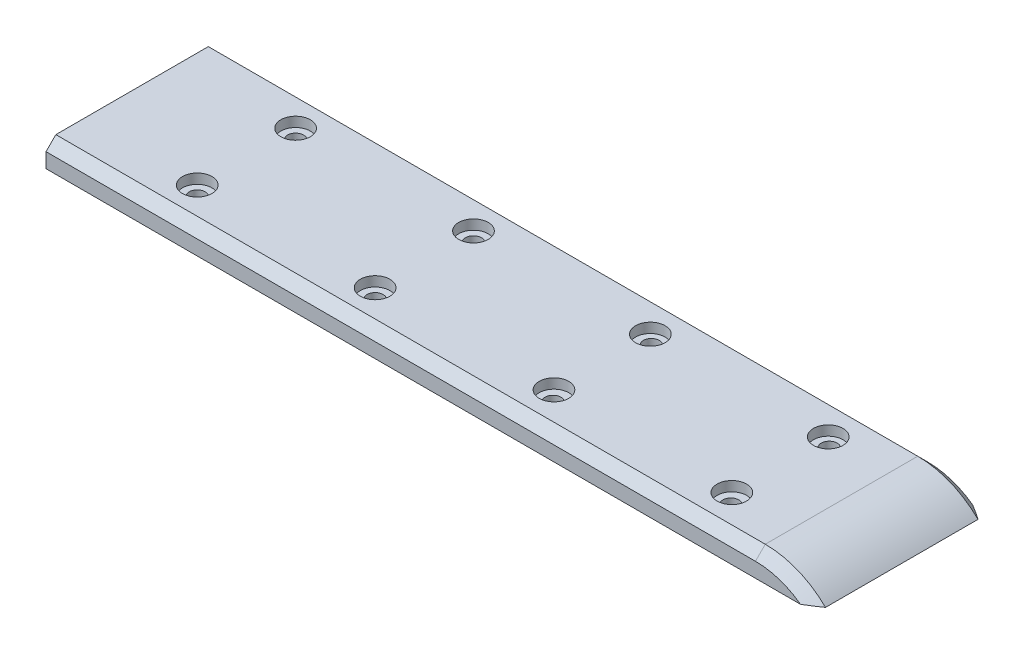
ISO-10303-21;
HEADER;
FILE_DESCRIPTION(('STEP AP214'),'2;1');
FILE_NAME('part.step','',(''),(''),'','','');
FILE_SCHEMA(('AUTOMOTIVE_DESIGN { 1 0 10303 214 1 1 1 1 }'));
ENDSEC;
DATA;
#1=APPLICATION_CONTEXT('core data for automotive mechanical design processes');
#2=APPLICATION_PROTOCOL_DEFINITION('international standard','automotive_design',2000,#1);
#3=PRODUCT_CONTEXT('',#1,'mechanical');
#4=PRODUCT('Part','Part','',(#3));
#5=PRODUCT_RELATED_PRODUCT_CATEGORY('part','',(#4));
#6=PRODUCT_DEFINITION_FORMATION('','',#4);
#7=PRODUCT_DEFINITION_CONTEXT('part definition',#1,'design');
#8=PRODUCT_DEFINITION('design','',#6,#7);
#9=PRODUCT_DEFINITION_SHAPE('','',#8);
#10=(LENGTH_UNIT() NAMED_UNIT(*) SI_UNIT(.MILLI.,.METRE.));
#11=(NAMED_UNIT(*) PLANE_ANGLE_UNIT() SI_UNIT($,.RADIAN.));
#12=(NAMED_UNIT(*) SI_UNIT($,.STERADIAN.) SOLID_ANGLE_UNIT());
#13=UNCERTAINTY_MEASURE_WITH_UNIT(LENGTH_MEASURE(1.E-05),#10,'distance_accuracy_value','');
#14=(GEOMETRIC_REPRESENTATION_CONTEXT(3) GLOBAL_UNCERTAINTY_ASSIGNED_CONTEXT((#13)) GLOBAL_UNIT_ASSIGNED_CONTEXT((#10,
#11,#12)) REPRESENTATION_CONTEXT('',''));
#15=CARTESIAN_POINT('',(0.,0.,0.));
#16=DIRECTION('',(0.,0.,1.));
#17=DIRECTION('',(1.,0.,0.));
#18=AXIS2_PLACEMENT_3D('',#15,#16,#17);
#19=CARTESIAN_POINT('',(62.5000000000001,22.0961940777126,10.));
#20=DIRECTION('',(0.,-1.,0.));
#21=DIRECTION('',(1.,0.,0.));
#22=AXIS2_PLACEMENT_3D('',#19,#20,#21);
#23=CYLINDRICAL_SURFACE('',#22,1.625);
#24=CARTESIAN_POINT('',(62.5000000000001,12.5,10.));
#25=DIRECTION('',(0.,1.,0.));
#26=DIRECTION('',(1.,0.,0.));
#27=AXIS2_PLACEMENT_3D('',#24,#25,#26);
#28=CIRCLE('',#27,1.625);
#29=CARTESIAN_POINT('',(64.1250000000001,12.5,10.));
#30=VERTEX_POINT('',#29);
#31=EDGE_CURVE('E155',#30,#30,#28,.T.);
#32=ORIENTED_EDGE('',*,*,#31,.F.);
#33=EDGE_LOOP('',(#32));
#34=FACE_BOUND('',#33,.T.);
#35=CARTESIAN_POINT('',(62.5000000000001,15.5,10.));
#36=DIRECTION('',(0.,1.,0.));
#37=DIRECTION('',(-1.,0.,0.));
#38=AXIS2_PLACEMENT_3D('',#35,#36,#37);
#39=CIRCLE('',#38,1.625);
#40=CARTESIAN_POINT('',(60.8750000000001,15.5,10.));
#41=VERTEX_POINT('',#40);
#42=EDGE_CURVE('E152',#41,#41,#39,.T.);
#43=ORIENTED_EDGE('',*,*,#42,.T.);
#44=EDGE_LOOP('',(#43));
#45=FACE_BOUND('',#44,.T.);
#46=ADVANCED_FACE('F37',(#34,#45),#23,.F.);
#47=CARTESIAN_POINT('',(26.3333333333334,22.0961940777126,9.99999999999997));
#48=DIRECTION('',(0.,-1.,0.));
#49=DIRECTION('',(1.,0.,0.));
#50=AXIS2_PLACEMENT_3D('',#47,#48,#49);
#51=CYLINDRICAL_SURFACE('',#50,1.625);
#52=CARTESIAN_POINT('',(26.3333333333334,12.5,9.99999999999997));
#53=DIRECTION('',(0.,1.,0.));
#54=DIRECTION('',(1.,0.,0.));
#55=AXIS2_PLACEMENT_3D('',#52,#53,#54);
#56=CIRCLE('',#55,1.625);
#57=CARTESIAN_POINT('',(27.9583333333334,12.5,9.99999999999997));
#58=VERTEX_POINT('',#57);
#59=EDGE_CURVE('E374',#58,#58,#56,.T.);
#60=ORIENTED_EDGE('',*,*,#59,.F.);
#61=EDGE_LOOP('',(#60));
#62=FACE_BOUND('',#61,.T.);
#63=CARTESIAN_POINT('',(26.3333333333334,15.5,9.99999999999997));
#64=DIRECTION('',(0.,1.,0.));
#65=DIRECTION('',(-1.,0.,0.));
#66=AXIS2_PLACEMENT_3D('',#63,#64,#65);
#67=CIRCLE('',#66,1.625);
#68=CARTESIAN_POINT('',(24.7083333333334,15.5,9.99999999999997));
#69=VERTEX_POINT('',#68);
#70=EDGE_CURVE('E149',#69,#69,#67,.T.);
#71=ORIENTED_EDGE('',*,*,#70,.T.);
#72=EDGE_LOOP('',(#71));
#73=FACE_BOUND('',#72,.T.);
#74=ADVANCED_FACE('F213',(#62,#73),#51,.F.);
#75=CARTESIAN_POINT('',(-9.83333333333332,22.0961940777126,10.));
#76=DIRECTION('',(0.,-1.,0.));
#77=DIRECTION('',(1.,0.,0.));
#78=AXIS2_PLACEMENT_3D('',#75,#76,#77);
#79=CYLINDRICAL_SURFACE('',#78,1.625);
#80=CARTESIAN_POINT('',(-9.83333333333332,12.5,10.));
#81=DIRECTION('',(0.,1.,0.));
#82=DIRECTION('',(1.,0.,0.));
#83=AXIS2_PLACEMENT_3D('',#80,#81,#82);
#84=CIRCLE('',#83,1.625);
#85=CARTESIAN_POINT('',(-8.20833333333332,12.5,10.));
#86=VERTEX_POINT('',#85);
#87=EDGE_CURVE('E377',#86,#86,#84,.T.);
#88=ORIENTED_EDGE('',*,*,#87,.F.);
#89=EDGE_LOOP('',(#88));
#90=FACE_BOUND('',#89,.T.);
#91=CARTESIAN_POINT('',(-9.83333333333332,15.5,10.));
#92=DIRECTION('',(0.,1.,0.));
#93=DIRECTION('',(-1.,0.,0.));
#94=AXIS2_PLACEMENT_3D('',#91,#92,#93);
#95=CIRCLE('',#94,1.625);
#96=CARTESIAN_POINT('',(-11.4583333333333,15.5,10.));
#97=VERTEX_POINT('',#96);
#98=EDGE_CURVE('E145',#97,#97,#95,.T.);
#99=ORIENTED_EDGE('',*,*,#98,.T.);
#100=EDGE_LOOP('',(#99));
#101=FACE_BOUND('',#100,.T.);
#102=ADVANCED_FACE('F219',(#90,#101),#79,.F.);
#103=CARTESIAN_POINT('',(-46.,22.0961940777126,10.));
#104=DIRECTION('',(0.,-1.,0.));
#105=DIRECTION('',(1.,0.,0.));
#106=AXIS2_PLACEMENT_3D('',#103,#104,#105);
#107=CYLINDRICAL_SURFACE('',#106,1.625);
#108=CARTESIAN_POINT('',(-46.,12.5,10.));
#109=DIRECTION('',(0.,1.,0.));
#110=DIRECTION('',(1.,0.,0.));
#111=AXIS2_PLACEMENT_3D('',#108,#109,#110);
#112=CIRCLE('',#111,1.625);
#113=CARTESIAN_POINT('',(-44.375,12.5,10.));
#114=VERTEX_POINT('',#113);
#115=EDGE_CURVE('E358',#114,#114,#112,.T.);
#116=ORIENTED_EDGE('',*,*,#115,.F.);
#117=EDGE_LOOP('',(#116));
#118=FACE_BOUND('',#117,.T.);
#119=CARTESIAN_POINT('',(-46.,15.5,10.));
#120=DIRECTION('',(0.,1.,0.));
#121=DIRECTION('',(-1.,0.,0.));
#122=AXIS2_PLACEMENT_3D('',#119,#120,#121);
#123=CIRCLE('',#122,1.625);
#124=CARTESIAN_POINT('',(-47.625,15.5,10.));
#125=VERTEX_POINT('',#124);
#126=EDGE_CURVE('E142',#125,#125,#123,.T.);
#127=ORIENTED_EDGE('',*,*,#126,.T.);
#128=EDGE_LOOP('',(#127));
#129=FACE_BOUND('',#128,.T.);
#130=ADVANCED_FACE('F273',(#118,#129),#107,.F.);
#131=CARTESIAN_POINT('',(62.5000000000001,22.0961940777126,-10.));
#132=DIRECTION('',(0.,-1.,0.));
#133=DIRECTION('',(1.,0.,0.));
#134=AXIS2_PLACEMENT_3D('',#131,#132,#133);
#135=CYLINDRICAL_SURFACE('',#134,1.625);
#136=CARTESIAN_POINT('',(62.5000000000001,12.5,-10.));
#137=DIRECTION('',(0.,-1.,0.));
#138=DIRECTION('',(1.,0.,0.));
#139=AXIS2_PLACEMENT_3D('',#136,#137,#138);
#140=CIRCLE('',#139,1.625);
#141=CARTESIAN_POINT('',(64.1250000000001,12.5,-10.));
#142=VERTEX_POINT('',#141);
#143=EDGE_CURVE('E141',#142,#142,#140,.T.);
#144=ORIENTED_EDGE('',*,*,#143,.T.);
#145=EDGE_LOOP('',(#144));
#146=FACE_BOUND('',#145,.T.);
#147=CARTESIAN_POINT('',(62.5000000000001,15.5,-10.));
#148=DIRECTION('',(0.,1.,0.));
#149=DIRECTION('',(-1.,0.,0.));
#150=AXIS2_PLACEMENT_3D('',#147,#148,#149);
#151=CIRCLE('',#150,1.625);
#152=CARTESIAN_POINT('',(60.8750000000001,15.5,-10.));
#153=VERTEX_POINT('',#152);
#154=EDGE_CURVE('E138',#153,#153,#151,.F.);
#155=ORIENTED_EDGE('',*,*,#154,.F.);
#156=EDGE_LOOP('',(#155));
#157=FACE_BOUND('',#156,.T.);
#158=ADVANCED_FACE('F269',(#146,#157),#135,.F.);
#159=CARTESIAN_POINT('',(26.3333333333334,22.0961940777126,-9.99999999999997));
#160=DIRECTION('',(0.,-1.,0.));
#161=DIRECTION('',(1.,0.,0.));
#162=AXIS2_PLACEMENT_3D('',#159,#160,#161);
#163=CYLINDRICAL_SURFACE('',#162,1.625);
#164=CARTESIAN_POINT('',(26.3333333333334,12.5,-9.99999999999997));
#165=DIRECTION('',(0.,-1.,0.));
#166=DIRECTION('',(1.,0.,0.));
#167=AXIS2_PLACEMENT_3D('',#164,#165,#166);
#168=CIRCLE('',#167,1.625);
#169=CARTESIAN_POINT('',(27.9583333333334,12.5,-9.99999999999997));
#170=VERTEX_POINT('',#169);
#171=EDGE_CURVE('E351',#170,#170,#168,.T.);
#172=ORIENTED_EDGE('',*,*,#171,.T.);
#173=EDGE_LOOP('',(#172));
#174=FACE_BOUND('',#173,.T.);
#175=CARTESIAN_POINT('',(26.3333333333334,15.5,-9.99999999999997));
#176=DIRECTION('',(0.,1.,0.));
#177=DIRECTION('',(-1.,0.,0.));
#178=AXIS2_PLACEMENT_3D('',#175,#176,#177);
#179=CIRCLE('',#178,1.625);
#180=CARTESIAN_POINT('',(24.7083333333334,15.5,-9.99999999999997));
#181=VERTEX_POINT('',#180);
#182=EDGE_CURVE('E135',#181,#181,#179,.F.);
#183=ORIENTED_EDGE('',*,*,#182,.F.);
#184=EDGE_LOOP('',(#183));
#185=FACE_BOUND('',#184,.T.);
#186=ADVANCED_FACE('F265',(#174,#185),#163,.F.);
#187=CARTESIAN_POINT('',(-9.83333333333332,22.0961940777126,-10.));
#188=DIRECTION('',(0.,-1.,0.));
#189=DIRECTION('',(1.,0.,0.));
#190=AXIS2_PLACEMENT_3D('',#187,#188,#189);
#191=CYLINDRICAL_SURFACE('',#190,1.625);
#192=CARTESIAN_POINT('',(-9.83333333333332,12.5,-10.));
#193=DIRECTION('',(0.,-1.,0.));
#194=DIRECTION('',(1.,0.,0.));
#195=AXIS2_PLACEMENT_3D('',#192,#193,#194);
#196=CIRCLE('',#195,1.625);
#197=CARTESIAN_POINT('',(-8.20833333333332,12.5,-10.));
#198=VERTEX_POINT('',#197);
#199=EDGE_CURVE('E346',#198,#198,#196,.T.);
#200=ORIENTED_EDGE('',*,*,#199,.T.);
#201=EDGE_LOOP('',(#200));
#202=FACE_BOUND('',#201,.T.);
#203=CARTESIAN_POINT('',(-9.83333333333332,15.5,-10.));
#204=DIRECTION('',(0.,1.,0.));
#205=DIRECTION('',(-1.,0.,0.));
#206=AXIS2_PLACEMENT_3D('',#203,#204,#205);
#207=CIRCLE('',#206,1.625);
#208=CARTESIAN_POINT('',(-11.4583333333333,15.5,-10.));
#209=VERTEX_POINT('',#208);
#210=EDGE_CURVE('E131',#209,#209,#207,.F.);
#211=ORIENTED_EDGE('',*,*,#210,.F.);
#212=EDGE_LOOP('',(#211));
#213=FACE_BOUND('',#212,.T.);
#214=ADVANCED_FACE('F261',(#202,#213),#191,.F.);
#215=CARTESIAN_POINT('',(-46.,22.0961940777126,-10.));
#216=DIRECTION('',(0.,-1.,0.));
#217=DIRECTION('',(1.,0.,0.));
#218=AXIS2_PLACEMENT_3D('',#215,#216,#217);
#219=CYLINDRICAL_SURFACE('',#218,1.625);
#220=CARTESIAN_POINT('',(-46.,12.5,-10.));
#221=DIRECTION('',(0.,-1.,0.));
#222=DIRECTION('',(1.,0.,0.));
#223=AXIS2_PLACEMENT_3D('',#220,#221,#222);
#224=CIRCLE('',#223,1.625);
#225=CARTESIAN_POINT('',(-44.375,12.5,-10.));
#226=VERTEX_POINT('',#225);
#227=EDGE_CURVE('E343',#226,#226,#224,.T.);
#228=ORIENTED_EDGE('',*,*,#227,.T.);
#229=EDGE_LOOP('',(#228));
#230=FACE_BOUND('',#229,.T.);
#231=CARTESIAN_POINT('',(-46.,15.5,-10.));
#232=DIRECTION('',(0.,1.,0.));
#233=DIRECTION('',(-1.,0.,0.));
#234=AXIS2_PLACEMENT_3D('',#231,#232,#233);
#235=CIRCLE('',#234,1.625);
#236=CARTESIAN_POINT('',(-47.625,15.5,-10.));
#237=VERTEX_POINT('',#236);
#238=EDGE_CURVE('E128',#237,#237,#235,.F.);
#239=ORIENTED_EDGE('',*,*,#238,.F.);
#240=EDGE_LOOP('',(#239));
#241=FACE_BOUND('',#240,.T.);
#242=ADVANCED_FACE('F187',(#230,#241),#219,.F.);
#243=CARTESIAN_POINT('',(87.2474487139159,12.5,17.5));
#244=DIRECTION('',(0.,1.,0.));
#245=DIRECTION('',(-1.,0.,0.));
#246=AXIS2_PLACEMENT_3D('',#243,#244,#245);
#247=PLANE('',#246);
#248=ORIENTED_EDGE('',*,*,#115,.T.);
#249=EDGE_LOOP('',(#248));
#250=FACE_BOUND('',#249,.T.);
#251=ORIENTED_EDGE('',*,*,#87,.T.);
#252=EDGE_LOOP('',(#251));
#253=FACE_BOUND('',#252,.T.);
#254=ORIENTED_EDGE('',*,*,#59,.T.);
#255=EDGE_LOOP('',(#254));
#256=FACE_BOUND('',#255,.T.);
#257=ORIENTED_EDGE('',*,*,#31,.T.);
#258=EDGE_LOOP('',(#257));
#259=FACE_BOUND('',#258,.T.);
#260=ORIENTED_EDGE('',*,*,#227,.F.);
#261=EDGE_LOOP('',(#260));
#262=FACE_BOUND('',#261,.T.);
#263=ORIENTED_EDGE('',*,*,#199,.F.);
#264=EDGE_LOOP('',(#263));
#265=FACE_BOUND('',#264,.T.);
#266=ORIENTED_EDGE('',*,*,#171,.F.);
#267=EDGE_LOOP('',(#266));
#268=FACE_BOUND('',#267,.T.);
#269=ORIENTED_EDGE('',*,*,#143,.F.);
#270=EDGE_LOOP('',(#269));
#271=FACE_BOUND('',#270,.T.);
#272=DIRECTION('',(0.,0.,-1.));
#273=VECTOR('',#272,1.);
#274=CARTESIAN_POINT('',(87.2474487139159,12.5,17.5));
#275=LINE('',#274,#273);
#276=CARTESIAN_POINT('',(87.2474487139159,12.5,15.5));
#277=VERTEX_POINT('',#276);
#278=CARTESIAN_POINT('',(87.2474487139159,12.5,-15.5));
#279=VERTEX_POINT('',#278);
#280=EDGE_CURVE('E124',#277,#279,#275,.T.);
#281=ORIENTED_EDGE('',*,*,#280,.F.);
#282=CARTESIAN_POINT('',(87.2474487139159,12.5,15.5));
#283=CARTESIAN_POINT('',(86.9964877108866,12.5,15.6756172945295));
#284=CARTESIAN_POINT('',(86.7442419059624,12.5,15.849416953267));
#285=CARTESIAN_POINT('',(86.2369787479366,12.5,16.1927194087836));
#286=CARTESIAN_POINT('',(85.9819624339059,12.5,16.3622237420843));
#287=CARTESIAN_POINT('',(85.4687573416287,12.5,16.6964135222086));
#288=CARTESIAN_POINT('',(85.210568351371,12.5,16.8610986444784));
#289=CARTESIAN_POINT('',(84.6906080472939,12.5,17.1849216002896));
#290=CARTESIAN_POINT('',(84.4288354658246,12.5,17.3440573963148));
#291=CARTESIAN_POINT('',(84.1651513899116,12.5,17.5));
#292=B_SPLINE_CURVE_WITH_KNOTS('',3,(#282,#283,#284,#285,#286,#287,#288,#289,#290,#291),
.UNSPECIFIED.,.F.,.F.,(4,2,2,2,4),(0.,0.918922488747956,1.83751148308623,2.75616219883705,
3.67514673333101),.UNSPECIFIED.);
#293=CARTESIAN_POINT('',(84.1651513899117,12.5,17.5));
#294=VERTEX_POINT('',#293);
#295=EDGE_CURVE('E172',#277,#294,#292,.T.);
#296=ORIENTED_EDGE('',*,*,#295,.T.);
#297=DIRECTION('',(1.,0.,0.));
#298=VECTOR('',#297,1.);
#299=CARTESIAN_POINT('',(87.2474487139159,12.5,17.5));
#300=LINE('',#299,#298);
#301=CARTESIAN_POINT('',(-69.2474487139159,12.5,17.5));
#302=VERTEX_POINT('',#301);
#303=EDGE_CURVE('E112',#302,#294,#300,.T.);
#304=ORIENTED_EDGE('',*,*,#303,.F.);
#305=DIRECTION('',(0.,0.,1.));
#306=VECTOR('',#305,1.);
#307=CARTESIAN_POINT('',(-69.2474487139159,12.5,-17.5));
#308=LINE('',#307,#306);
#309=CARTESIAN_POINT('',(-69.2474487139159,12.5,-17.5));
#310=VERTEX_POINT('',#309);
#311=EDGE_CURVE('E99',#310,#302,#308,.T.);
#312=ORIENTED_EDGE('',*,*,#311,.F.);
#313=DIRECTION('',(1.,0.,0.));
#314=VECTOR('',#313,1.);
#315=CARTESIAN_POINT('',(87.2474487139159,12.5,-17.5));
#316=LINE('',#315,#314);
#317=CARTESIAN_POINT('',(84.1651513899117,12.5,-17.5));
#318=VERTEX_POINT('',#317);
#319=EDGE_CURVE('E109',#310,#318,#316,.T.);
#320=ORIENTED_EDGE('',*,*,#319,.T.);
#321=CARTESIAN_POINT('',(84.1651513899117,12.5,-17.5));
#322=CARTESIAN_POINT('',(84.4288354658246,12.5,-17.3440573963148));
#323=CARTESIAN_POINT('',(84.6906080472939,12.5,-17.1849216002896));
#324=CARTESIAN_POINT('',(85.210568351371,12.5,-16.8610986444784));
#325=CARTESIAN_POINT('',(85.4687573416288,12.5,-16.6964135222086));
#326=CARTESIAN_POINT('',(85.9819624339059,12.5,-16.3622237420843));
#327=CARTESIAN_POINT('',(86.2369787479366,12.5,-16.1927194087836));
#328=CARTESIAN_POINT('',(86.7442419059624,12.5,-15.849416953267));
#329=CARTESIAN_POINT('',(86.9964877108866,12.5,-15.6756172945295));
#330=CARTESIAN_POINT('',(87.2474487139159,12.5,-15.5));
#331=B_SPLINE_CURVE_WITH_KNOTS('',3,(#321,#322,#323,#324,#325,#326,#327,#328,#329,#330),
.UNSPECIFIED.,.F.,.F.,(4,2,2,2,4),(0.,0.91898453449396,1.83763525024477,2.756224244583,
3.67514673333098),.UNSPECIFIED.);
#332=EDGE_CURVE('E165',#318,#279,#331,.T.);
#333=ORIENTED_EDGE('',*,*,#332,.T.);
#334=EDGE_LOOP('',(#281,#296,#304,#312,#320,#333));
#335=FACE_BOUND('',#334,.T.);
#336=ADVANCED_FACE('F108',(#250,#253,#256,#259,#262,#265,#268,#271,#335),#247,.F.);
#337=CARTESIAN_POINT('',(75.,0.,17.5));
#338=DIRECTION('',(0.,0.,-1.));
#339=DIRECTION('',(-1.,0.,0.));
#340=AXIS2_PLACEMENT_3D('',#337,#338,#339);
#341=CYLINDRICAL_SURFACE('',#340,17.5);
#342=DIRECTION('',(0.,0.,-1.));
#343=VECTOR('',#342,1.);
#344=CARTESIAN_POINT('',(75.,17.5,17.5));
#345=LINE('',#344,#343);
#346=CARTESIAN_POINT('',(75.,17.5,15.5));
#347=VERTEX_POINT('',#346);
#348=CARTESIAN_POINT('',(75.,17.5,-15.5));
#349=VERTEX_POINT('',#348);
#350=EDGE_CURVE('E117',#347,#349,#345,.T.);
#351=ORIENTED_EDGE('',*,*,#350,.F.);
#352=CARTESIAN_POINT('',(75.,0.,15.5));
#353=DIRECTION('',(0.,0.,1.));
#354=DIRECTION('',(1.,0.,0.));
#355=AXIS2_PLACEMENT_3D('',#352,#353,#354);
#356=CIRCLE('',#355,17.5);
#357=EDGE_CURVE('E163',#347,#277,#356,.F.);
#358=ORIENTED_EDGE('',*,*,#357,.T.);
#359=ORIENTED_EDGE('',*,*,#280,.T.);
#360=CARTESIAN_POINT('',(75.,0.,-15.5));
#361=DIRECTION('',(0.,0.,1.));
#362=DIRECTION('',(1.,0.,0.));
#363=AXIS2_PLACEMENT_3D('',#360,#361,#362);
#364=CIRCLE('',#363,17.5);
#365=EDGE_CURVE('E160',#279,#349,#364,.T.);
#366=ORIENTED_EDGE('',*,*,#365,.T.);
#367=EDGE_LOOP('',(#351,#358,#359,#366));
#368=FACE_BOUND('',#367,.T.);
#369=ADVANCED_FACE('F186',(#368),#341,.T.);
#370=CARTESIAN_POINT('',(-75.,17.5,17.5));
#371=DIRECTION('',(0.,-1.,0.));
#372=DIRECTION('',(1.,0.,0.));
#373=AXIS2_PLACEMENT_3D('',#370,#371,#372);
#374=PLANE('',#373);
#375=CARTESIAN_POINT('',(62.5000000000014,17.5,9.7999999999996));
#376=DIRECTION('',(0.,-1.,0.));
#377=DIRECTION('',(-1.,0.,0.));
#378=AXIS2_PLACEMENT_3D('',#375,#376,#377);
#379=CIRCLE('',#378,2.99999999999884);
#380=CARTESIAN_POINT('',(59.5000000000025,17.5,9.7999999999996));
#381=VERTEX_POINT('',#380);
#382=EDGE_CURVE('E292',#381,#381,#379,.T.);
#383=ORIENTED_EDGE('',*,*,#382,.T.);
#384=EDGE_LOOP('',(#383));
#385=FACE_BOUND('',#384,.T.);
#386=CARTESIAN_POINT('',(26.3333333333346,17.5,9.79999999999892));
#387=DIRECTION('',(0.,-1.,0.));
#388=DIRECTION('',(-1.,0.,0.));
#389=AXIS2_PLACEMENT_3D('',#386,#387,#388);
#390=CIRCLE('',#389,2.99999999999904);
#391=CARTESIAN_POINT('',(23.3333333333356,17.5,9.79999999999892));
#392=VERTEX_POINT('',#391);
#393=EDGE_CURVE('E296',#392,#392,#390,.T.);
#394=ORIENTED_EDGE('',*,*,#393,.T.);
#395=EDGE_LOOP('',(#394));
#396=FACE_BOUND('',#395,.T.);
#397=CARTESIAN_POINT('',(-9.83333333333332,17.5,10.));
#398=DIRECTION('',(0.,-1.,0.));
#399=DIRECTION('',(-1.,0.,0.));
#400=AXIS2_PLACEMENT_3D('',#397,#398,#399);
#401=CIRCLE('',#400,3.);
#402=CARTESIAN_POINT('',(-12.8333333333333,17.5,10.));
#403=VERTEX_POINT('',#402);
#404=EDGE_CURVE('E300',#403,#403,#401,.T.);
#405=ORIENTED_EDGE('',*,*,#404,.T.);
#406=EDGE_LOOP('',(#405));
#407=FACE_BOUND('',#406,.T.);
#408=CARTESIAN_POINT('',(-46.,17.5,10.));
#409=DIRECTION('',(0.,-1.,0.));
#410=DIRECTION('',(-1.,0.,0.));
#411=AXIS2_PLACEMENT_3D('',#408,#409,#410);
#412=CIRCLE('',#411,3.);
#413=CARTESIAN_POINT('',(-49.,17.5,10.));
#414=VERTEX_POINT('',#413);
#415=EDGE_CURVE('E304',#414,#414,#412,.T.);
#416=ORIENTED_EDGE('',*,*,#415,.T.);
#417=EDGE_LOOP('',(#416));
#418=FACE_BOUND('',#417,.T.);
#419=CARTESIAN_POINT('',(62.5000000000014,17.5,-9.7999999999996));
#420=DIRECTION('',(0.,1.,0.));
#421=DIRECTION('',(-1.,0.,0.));
#422=AXIS2_PLACEMENT_3D('',#419,#420,#421);
#423=CIRCLE('',#422,2.99999999999884);
#424=CARTESIAN_POINT('',(59.5000000000025,17.5,-9.7999999999996));
#425=VERTEX_POINT('',#424);
#426=EDGE_CURVE('E308',#425,#425,#423,.T.);
#427=ORIENTED_EDGE('',*,*,#426,.F.);
#428=EDGE_LOOP('',(#427));
#429=FACE_BOUND('',#428,.T.);
#430=CARTESIAN_POINT('',(26.3333333333346,17.5,-9.79999999999892));
#431=DIRECTION('',(0.,1.,0.));
#432=DIRECTION('',(-1.,0.,0.));
#433=AXIS2_PLACEMENT_3D('',#430,#431,#432);
#434=CIRCLE('',#433,2.99999999999904);
#435=CARTESIAN_POINT('',(23.3333333333356,17.5,-9.79999999999892));
#436=VERTEX_POINT('',#435);
#437=EDGE_CURVE('E312',#436,#436,#434,.T.);
#438=ORIENTED_EDGE('',*,*,#437,.F.);
#439=EDGE_LOOP('',(#438));
#440=FACE_BOUND('',#439,.T.);
#441=CARTESIAN_POINT('',(-9.83333333333332,17.5,-10.));
#442=DIRECTION('',(0.,1.,0.));
#443=DIRECTION('',(-1.,0.,0.));
#444=AXIS2_PLACEMENT_3D('',#441,#442,#443);
#445=CIRCLE('',#444,3.);
#446=CARTESIAN_POINT('',(-12.8333333333333,17.5,-10.));
#447=VERTEX_POINT('',#446);
#448=EDGE_CURVE('E316',#447,#447,#445,.T.);
#449=ORIENTED_EDGE('',*,*,#448,.F.);
#450=EDGE_LOOP('',(#449));
#451=FACE_BOUND('',#450,.T.);
#452=CARTESIAN_POINT('',(-46.,17.5,-10.));
#453=DIRECTION('',(0.,1.,0.));
#454=DIRECTION('',(-1.,0.,0.));
#455=AXIS2_PLACEMENT_3D('',#452,#453,#454);
#456=CIRCLE('',#455,3.);
#457=CARTESIAN_POINT('',(-49.,17.5,-10.));
#458=VERTEX_POINT('',#457);
#459=EDGE_CURVE('E320',#458,#458,#456,.T.);
#460=ORIENTED_EDGE('',*,*,#459,.F.);
#461=EDGE_LOOP('',(#460));
#462=FACE_BOUND('',#461,.T.);
#463=DIRECTION('',(0.,0.,1.));
#464=VECTOR('',#463,1.);
#465=CARTESIAN_POINT('',(-69.2474487139159,17.5,-17.5));
#466=LINE('',#465,#464);
#467=CARTESIAN_POINT('',(-69.2474487139159,17.5,-15.5));
#468=VERTEX_POINT('',#467);
#469=CARTESIAN_POINT('',(-69.2474487139159,17.5,15.5));
#470=VERTEX_POINT('',#469);
#471=EDGE_CURVE('E113',#468,#470,#466,.T.);
#472=ORIENTED_EDGE('',*,*,#471,.T.);
#473=DIRECTION('',(1.,0.,0.));
#474=VECTOR('',#473,1.);
#475=CARTESIAN_POINT('',(75.,17.5,15.5));
#476=LINE('',#475,#474);
#477=EDGE_CURVE('E322',#470,#347,#476,.T.);
#478=ORIENTED_EDGE('',*,*,#477,.T.);
#479=ORIENTED_EDGE('',*,*,#350,.T.);
#480=DIRECTION('',(-1.,0.,0.));
#481=VECTOR('',#480,1.);
#482=CARTESIAN_POINT('',(-75.,17.5,-15.5));
#483=LINE('',#482,#481);
#484=EDGE_CURVE('E325',#349,#468,#483,.T.);
#485=ORIENTED_EDGE('',*,*,#484,.T.);
#486=EDGE_LOOP('',(#472,#478,#479,#485));
#487=FACE_BOUND('',#486,.T.);
#488=ADVANCED_FACE('F280',(#385,#396,#407,#418,#429,#440,#451,#462,#487),#374,.F.);
#489=CARTESIAN_POINT('',(-75.,0.,17.5));
#490=DIRECTION('',(0.,0.,1.));
#491=DIRECTION('',(1.,0.,0.));
#492=AXIS2_PLACEMENT_3D('',#489,#490,#491);
#493=PLANE('',#492);
#494=ORIENTED_EDGE('',*,*,#303,.T.);
#495=CARTESIAN_POINT('',(75.,0.,17.5));
#496=DIRECTION('',(0.,0.,1.));
#497=DIRECTION('',(1.,0.,0.));
#498=AXIS2_PLACEMENT_3D('',#495,#496,#497);
#499=CIRCLE('',#498,15.5);
#500=CARTESIAN_POINT('',(75.,15.5,17.5));
#501=VERTEX_POINT('',#500);
#502=EDGE_CURVE('E157',#294,#501,#499,.T.);
#503=ORIENTED_EDGE('',*,*,#502,.T.);
#504=DIRECTION('',(-1.,0.,0.));
#505=VECTOR('',#504,1.);
#506=CARTESIAN_POINT('',(-69.2474487139159,15.5,17.5));
#507=LINE('',#506,#505);
#508=CARTESIAN_POINT('',(-69.2474487139159,15.5,17.5));
#509=VERTEX_POINT('',#508);
#510=EDGE_CURVE('E127',#501,#509,#507,.T.);
#511=ORIENTED_EDGE('',*,*,#510,.T.);
#512=DIRECTION('',(0.,1.,0.));
#513=VECTOR('',#512,1.);
#514=CARTESIAN_POINT('',(-69.2474487139159,12.5,17.5));
#515=LINE('',#514,#513);
#516=EDGE_CURVE('E102',#302,#509,#515,.T.);
#517=ORIENTED_EDGE('',*,*,#516,.F.);
#518=EDGE_LOOP('',(#494,#503,#511,#517));
#519=FACE_BOUND('',#518,.T.);
#520=ADVANCED_FACE('F277',(#519),#493,.T.);
#521=CARTESIAN_POINT('',(-75.,0.,-17.5));
#522=DIRECTION('',(0.,0.,1.));
#523=DIRECTION('',(1.,0.,0.));
#524=AXIS2_PLACEMENT_3D('',#521,#522,#523);
#525=PLANE('',#524);
#526=DIRECTION('',(1.,0.,0.));
#527=VECTOR('',#526,1.);
#528=CARTESIAN_POINT('',(-75.,15.5,-17.5));
#529=LINE('',#528,#527);
#530=CARTESIAN_POINT('',(-69.2474487139159,15.5,-17.5));
#531=VERTEX_POINT('',#530);
#532=CARTESIAN_POINT('',(75.,15.5,-17.5));
#533=VERTEX_POINT('',#532);
#534=EDGE_CURVE('E47',#531,#533,#529,.T.);
#535=ORIENTED_EDGE('',*,*,#534,.T.);
#536=CARTESIAN_POINT('',(75.,0.,-17.5));
#537=DIRECTION('',(0.,0.,1.));
#538=DIRECTION('',(1.,0.,0.));
#539=AXIS2_PLACEMENT_3D('',#536,#537,#538);
#540=CIRCLE('',#539,15.5);
#541=EDGE_CURVE('E11',#533,#318,#540,.F.);
#542=ORIENTED_EDGE('',*,*,#541,.T.);
#543=ORIENTED_EDGE('',*,*,#319,.F.);
#544=DIRECTION('',(0.,1.,0.));
#545=VECTOR('',#544,1.);
#546=CARTESIAN_POINT('',(-69.2474487139159,12.5,-17.5));
#547=LINE('',#546,#545);
#548=EDGE_CURVE('E95',#310,#531,#547,.T.);
#549=ORIENTED_EDGE('',*,*,#548,.T.);
#550=EDGE_LOOP('',(#535,#542,#543,#549));
#551=FACE_BOUND('',#550,.T.);
#552=ADVANCED_FACE('F115',(#551),#525,.F.);
#553=CARTESIAN_POINT('',(-69.2474487139159,12.5,-17.5));
#554=DIRECTION('',(1.,0.,0.));
#555=DIRECTION('',(0.,0.,-1.));
#556=AXIS2_PLACEMENT_3D('',#553,#554,#555);
#557=PLANE('',#556);
#558=ORIENTED_EDGE('',*,*,#516,.T.);
#559=DIRECTION('',(0.,0.707106781186545,-0.70710678118655));
#560=VECTOR('',#559,1.);
#561=CARTESIAN_POINT('',(-69.2474487139159,15.5,17.5));
#562=LINE('',#561,#560);
#563=EDGE_CURVE('E328',#509,#470,#562,.T.);
#564=ORIENTED_EDGE('',*,*,#563,.T.);
#565=ORIENTED_EDGE('',*,*,#471,.F.);
#566=DIRECTION('',(0.,0.70710678118655,0.707106781186545));
#567=VECTOR('',#566,1.);
#568=CARTESIAN_POINT('',(-69.2474487139159,17.5,-15.5));
#569=LINE('',#568,#567);
#570=EDGE_CURVE('E61',#468,#531,#569,.F.);
#571=ORIENTED_EDGE('',*,*,#570,.T.);
#572=ORIENTED_EDGE('',*,*,#548,.F.);
#573=ORIENTED_EDGE('',*,*,#311,.T.);
#574=EDGE_LOOP('',(#558,#564,#565,#571,#572,#573));
#575=FACE_BOUND('',#574,.T.);
#576=ADVANCED_FACE('F98',(#575),#557,.F.);
#577=CARTESIAN_POINT('',(-46.,15.5,-10.));
#578=DIRECTION('',(0.,1.,0.));
#579=DIRECTION('',(-1.,0.,0.));
#580=AXIS2_PLACEMENT_3D('',#577,#578,#579);
#581=PLANE('',#580);
#582=CARTESIAN_POINT('',(-46.,15.5,-10.));
#583=DIRECTION('',(0.,1.,0.));
#584=DIRECTION('',(-1.,0.,0.));
#585=AXIS2_PLACEMENT_3D('',#582,#583,#584);
#586=CIRCLE('',#585,3.);
#587=CARTESIAN_POINT('',(-49.,15.5,-10.));
#588=VERTEX_POINT('',#587);
#589=EDGE_CURVE('E357',#588,#588,#586,.T.);
#590=ORIENTED_EDGE('',*,*,#589,.T.);
#591=EDGE_LOOP('',(#590));
#592=FACE_BOUND('',#591,.T.);
#593=ORIENTED_EDGE('',*,*,#238,.T.);
#594=EDGE_LOOP('',(#593));
#595=FACE_BOUND('',#594,.T.);
#596=ADVANCED_FACE('F252',(#592,#595),#581,.T.);
#597=CARTESIAN_POINT('',(-46.,15.5,-10.));
#598=DIRECTION('',(0.,1.,0.));
#599=DIRECTION('',(-1.,0.,0.));
#600=AXIS2_PLACEMENT_3D('',#597,#598,#599);
#601=CYLINDRICAL_SURFACE('',#600,3.);
#602=ORIENTED_EDGE('',*,*,#589,.F.);
#603=EDGE_LOOP('',(#602));
#604=FACE_BOUND('',#603,.T.);
#605=ORIENTED_EDGE('',*,*,#459,.T.);
#606=EDGE_LOOP('',(#605));
#607=FACE_BOUND('',#606,.T.);
#608=ADVANCED_FACE('F247',(#604,#607),#601,.F.);
#609=CARTESIAN_POINT('',(-9.83333333333332,15.5,-10.));
#610=DIRECTION('',(0.,1.,0.));
#611=DIRECTION('',(-1.,0.,0.));
#612=AXIS2_PLACEMENT_3D('',#609,#610,#611);
#613=PLANE('',#612);
#614=CARTESIAN_POINT('',(-9.83333333333332,15.5,-10.));
#615=DIRECTION('',(0.,1.,0.));
#616=DIRECTION('',(-1.,0.,0.));
#617=AXIS2_PLACEMENT_3D('',#614,#615,#616);
#618=CIRCLE('',#617,3.);
#619=CARTESIAN_POINT('',(-12.8333333333333,15.5,-10.));
#620=VERTEX_POINT('',#619);
#621=EDGE_CURVE('E362',#620,#620,#618,.T.);
#622=ORIENTED_EDGE('',*,*,#621,.T.);
#623=EDGE_LOOP('',(#622));
#624=FACE_BOUND('',#623,.T.);
#625=ORIENTED_EDGE('',*,*,#210,.T.);
#626=EDGE_LOOP('',(#625));
#627=FACE_BOUND('',#626,.T.);
#628=ADVANCED_FACE('F244',(#624,#627),#613,.T.);
#629=CARTESIAN_POINT('',(-9.83333333333332,15.5,-10.));
#630=DIRECTION('',(0.,1.,0.));
#631=DIRECTION('',(-1.,0.,0.));
#632=AXIS2_PLACEMENT_3D('',#629,#630,#631);
#633=CYLINDRICAL_SURFACE('',#632,3.);
#634=ORIENTED_EDGE('',*,*,#621,.F.);
#635=EDGE_LOOP('',(#634));
#636=FACE_BOUND('',#635,.T.);
#637=ORIENTED_EDGE('',*,*,#448,.T.);
#638=EDGE_LOOP('',(#637));
#639=FACE_BOUND('',#638,.T.);
#640=ADVANCED_FACE('F239',(#636,#639),#633,.F.);
#641=CARTESIAN_POINT('',(26.3333333333346,15.5,-9.79999999999892));
#642=DIRECTION('',(0.,1.,0.));
#643=DIRECTION('',(-1.,0.,0.));
#644=AXIS2_PLACEMENT_3D('',#641,#642,#643);
#645=PLANE('',#644);
#646=CARTESIAN_POINT('',(26.3333333333346,15.5,-9.79999999999892));
#647=DIRECTION('',(0.,1.,0.));
#648=DIRECTION('',(-1.,0.,0.));
#649=AXIS2_PLACEMENT_3D('',#646,#647,#648);
#650=CIRCLE('',#649,2.99999999999904);
#651=CARTESIAN_POINT('',(23.3333333333356,15.5,-9.79999999999892));
#652=VERTEX_POINT('',#651);
#653=EDGE_CURVE('E366',#652,#652,#650,.T.);
#654=ORIENTED_EDGE('',*,*,#653,.T.);
#655=EDGE_LOOP('',(#654));
#656=FACE_BOUND('',#655,.T.);
#657=ORIENTED_EDGE('',*,*,#182,.T.);
#658=EDGE_LOOP('',(#657));
#659=FACE_BOUND('',#658,.T.);
#660=ADVANCED_FACE('F236',(#656,#659),#645,.T.);
#661=CARTESIAN_POINT('',(26.3333333333346,15.5,-9.79999999999892));
#662=DIRECTION('',(0.,1.,0.));
#663=DIRECTION('',(-1.,0.,0.));
#664=AXIS2_PLACEMENT_3D('',#661,#662,#663);
#665=CYLINDRICAL_SURFACE('',#664,2.99999999999904);
#666=ORIENTED_EDGE('',*,*,#653,.F.);
#667=EDGE_LOOP('',(#666));
#668=FACE_BOUND('',#667,.T.);
#669=ORIENTED_EDGE('',*,*,#437,.T.);
#670=EDGE_LOOP('',(#669));
#671=FACE_BOUND('',#670,.T.);
#672=ADVANCED_FACE('F230',(#668,#671),#665,.F.);
#673=CARTESIAN_POINT('',(62.5000000000014,15.5,-9.7999999999996));
#674=DIRECTION('',(0.,1.,0.));
#675=DIRECTION('',(-1.,0.,0.));
#676=AXIS2_PLACEMENT_3D('',#673,#674,#675);
#677=PLANE('',#676);
#678=CARTESIAN_POINT('',(62.5000000000014,15.5,-9.7999999999996));
#679=DIRECTION('',(0.,1.,0.));
#680=DIRECTION('',(-1.,0.,0.));
#681=AXIS2_PLACEMENT_3D('',#678,#679,#680);
#682=CIRCLE('',#681,2.99999999999884);
#683=CARTESIAN_POINT('',(59.5000000000025,15.5,-9.7999999999996));
#684=VERTEX_POINT('',#683);
#685=EDGE_CURVE('E132',#684,#684,#682,.T.);
#686=ORIENTED_EDGE('',*,*,#685,.T.);
#687=EDGE_LOOP('',(#686));
#688=FACE_BOUND('',#687,.T.);
#689=ORIENTED_EDGE('',*,*,#154,.T.);
#690=EDGE_LOOP('',(#689));
#691=FACE_BOUND('',#690,.T.);
#692=ADVANCED_FACE('F226',(#688,#691),#677,.T.);
#693=CARTESIAN_POINT('',(62.5000000000014,15.5,-9.7999999999996));
#694=DIRECTION('',(0.,1.,0.));
#695=DIRECTION('',(-1.,0.,0.));
#696=AXIS2_PLACEMENT_3D('',#693,#694,#695);
#697=CYLINDRICAL_SURFACE('',#696,2.99999999999884);
#698=ORIENTED_EDGE('',*,*,#685,.F.);
#699=EDGE_LOOP('',(#698));
#700=FACE_BOUND('',#699,.T.);
#701=ORIENTED_EDGE('',*,*,#426,.T.);
#702=EDGE_LOOP('',(#701));
#703=FACE_BOUND('',#702,.T.);
#704=ADVANCED_FACE('F229',(#700,#703),#697,.F.);
#705=CARTESIAN_POINT('',(-46.,15.5,10.));
#706=DIRECTION('',(0.,1.,0.));
#707=DIRECTION('',(-1.,0.,0.));
#708=AXIS2_PLACEMENT_3D('',#705,#706,#707);
#709=CYLINDRICAL_SURFACE('',#708,3.);
#710=CARTESIAN_POINT('',(-46.,15.5,10.));
#711=DIRECTION('',(0.,-1.,0.));
#712=DIRECTION('',(-1.,0.,0.));
#713=AXIS2_PLACEMENT_3D('',#710,#711,#712);
#714=CIRCLE('',#713,3.);
#715=CARTESIAN_POINT('',(-49.,15.5,10.));
#716=VERTEX_POINT('',#715);
#717=EDGE_CURVE('E336',#716,#716,#714,.T.);
#718=ORIENTED_EDGE('',*,*,#717,.T.);
#719=EDGE_LOOP('',(#718));
#720=FACE_BOUND('',#719,.T.);
#721=ORIENTED_EDGE('',*,*,#415,.F.);
#722=EDGE_LOOP('',(#721));
#723=FACE_BOUND('',#722,.T.);
#724=ADVANCED_FACE('F234',(#720,#723),#709,.F.);
#725=CARTESIAN_POINT('',(-46.,15.5,10.));
#726=DIRECTION('',(0.,1.,0.));
#727=DIRECTION('',(-1.,0.,0.));
#728=AXIS2_PLACEMENT_3D('',#725,#726,#727);
#729=PLANE('',#728);
#730=ORIENTED_EDGE('',*,*,#126,.F.);
#731=EDGE_LOOP('',(#730));
#732=FACE_BOUND('',#731,.T.);
#733=ORIENTED_EDGE('',*,*,#717,.F.);
#734=EDGE_LOOP('',(#733));
#735=FACE_BOUND('',#734,.T.);
#736=ADVANCED_FACE('F418',(#732,#735),#729,.T.);
#737=CARTESIAN_POINT('',(-9.83333333333332,15.5,10.));
#738=DIRECTION('',(0.,1.,0.));
#739=DIRECTION('',(-1.,0.,0.));
#740=AXIS2_PLACEMENT_3D('',#737,#738,#739);
#741=CYLINDRICAL_SURFACE('',#740,3.);
#742=CARTESIAN_POINT('',(-9.83333333333332,15.5,10.));
#743=DIRECTION('',(0.,-1.,0.));
#744=DIRECTION('',(-1.,0.,0.));
#745=AXIS2_PLACEMENT_3D('',#742,#743,#744);
#746=CIRCLE('',#745,3.);
#747=CARTESIAN_POINT('',(-12.8333333333333,15.5,10.));
#748=VERTEX_POINT('',#747);
#749=EDGE_CURVE('E385',#748,#748,#746,.T.);
#750=ORIENTED_EDGE('',*,*,#749,.T.);
#751=EDGE_LOOP('',(#750));
#752=FACE_BOUND('',#751,.T.);
#753=ORIENTED_EDGE('',*,*,#404,.F.);
#754=EDGE_LOOP('',(#753));
#755=FACE_BOUND('',#754,.T.);
#756=ADVANCED_FACE('F414',(#752,#755),#741,.F.);
#757=CARTESIAN_POINT('',(-9.83333333333332,15.5,10.));
#758=DIRECTION('',(0.,1.,0.));
#759=DIRECTION('',(-1.,0.,0.));
#760=AXIS2_PLACEMENT_3D('',#757,#758,#759);
#761=PLANE('',#760);
#762=ORIENTED_EDGE('',*,*,#98,.F.);
#763=EDGE_LOOP('',(#762));
#764=FACE_BOUND('',#763,.T.);
#765=ORIENTED_EDGE('',*,*,#749,.F.);
#766=EDGE_LOOP('',(#765));
#767=FACE_BOUND('',#766,.T.);
#768=ADVANCED_FACE('F410',(#764,#767),#761,.T.);
#769=CARTESIAN_POINT('',(26.3333333333346,15.5,9.79999999999892));
#770=DIRECTION('',(0.,1.,0.));
#771=DIRECTION('',(-1.,0.,0.));
#772=AXIS2_PLACEMENT_3D('',#769,#770,#771);
#773=CYLINDRICAL_SURFACE('',#772,2.99999999999904);
#774=CARTESIAN_POINT('',(26.3333333333346,15.5,9.79999999999892));
#775=DIRECTION('',(0.,-1.,0.));
#776=DIRECTION('',(-1.,0.,0.));
#777=AXIS2_PLACEMENT_3D('',#774,#775,#776);
#778=CIRCLE('',#777,2.99999999999904);
#779=CARTESIAN_POINT('',(23.3333333333356,15.5,9.79999999999892));
#780=VERTEX_POINT('',#779);
#781=EDGE_CURVE('E389',#780,#780,#778,.T.);
#782=ORIENTED_EDGE('',*,*,#781,.T.);
#783=EDGE_LOOP('',(#782));
#784=FACE_BOUND('',#783,.T.);
#785=ORIENTED_EDGE('',*,*,#393,.F.);
#786=EDGE_LOOP('',(#785));
#787=FACE_BOUND('',#786,.T.);
#788=ADVANCED_FACE('F404',(#784,#787),#773,.F.);
#789=CARTESIAN_POINT('',(26.3333333333346,15.5,9.79999999999892));
#790=DIRECTION('',(0.,1.,0.));
#791=DIRECTION('',(-1.,0.,0.));
#792=AXIS2_PLACEMENT_3D('',#789,#790,#791);
#793=PLANE('',#792);
#794=ORIENTED_EDGE('',*,*,#70,.F.);
#795=EDGE_LOOP('',(#794));
#796=FACE_BOUND('',#795,.T.);
#797=ORIENTED_EDGE('',*,*,#781,.F.);
#798=EDGE_LOOP('',(#797));
#799=FACE_BOUND('',#798,.T.);
#800=ADVANCED_FACE('F399',(#796,#799),#793,.T.);
#801=CARTESIAN_POINT('',(62.5000000000014,15.5,9.7999999999996));
#802=DIRECTION('',(0.,1.,0.));
#803=DIRECTION('',(-1.,0.,0.));
#804=AXIS2_PLACEMENT_3D('',#801,#802,#803);
#805=CYLINDRICAL_SURFACE('',#804,2.99999999999884);
#806=CARTESIAN_POINT('',(62.5000000000014,15.5,9.7999999999996));
#807=DIRECTION('',(0.,-1.,0.));
#808=DIRECTION('',(-1.,0.,0.));
#809=AXIS2_PLACEMENT_3D('',#806,#807,#808);
#810=CIRCLE('',#809,2.99999999999884);
#811=CARTESIAN_POINT('',(59.5000000000025,15.5,9.7999999999996));
#812=VERTEX_POINT('',#811);
#813=EDGE_CURVE('E146',#812,#812,#810,.T.);
#814=ORIENTED_EDGE('',*,*,#813,.T.);
#815=EDGE_LOOP('',(#814));
#816=FACE_BOUND('',#815,.T.);
#817=ORIENTED_EDGE('',*,*,#382,.F.);
#818=EDGE_LOOP('',(#817));
#819=FACE_BOUND('',#818,.T.);
#820=ADVANCED_FACE('F208',(#816,#819),#805,.F.);
#821=CARTESIAN_POINT('',(62.5000000000014,15.5,9.7999999999996));
#822=DIRECTION('',(0.,1.,0.));
#823=DIRECTION('',(-1.,0.,0.));
#824=AXIS2_PLACEMENT_3D('',#821,#822,#823);
#825=PLANE('',#824);
#826=ORIENTED_EDGE('',*,*,#42,.F.);
#827=EDGE_LOOP('',(#826));
#828=FACE_BOUND('',#827,.T.);
#829=ORIENTED_EDGE('',*,*,#813,.F.);
#830=EDGE_LOOP('',(#829));
#831=FACE_BOUND('',#830,.T.);
#832=ADVANCED_FACE('F203',(#828,#831),#825,.T.);
#833=CARTESIAN_POINT('',(-75.,15.5,17.5));
#834=DIRECTION('',(0.,0.70710678118655,0.707106781186545));
#835=DIRECTION('',(1.,0.,0.));
#836=AXIS2_PLACEMENT_3D('',#833,#834,#835);
#837=PLANE('',#836);
#838=ORIENTED_EDGE('',*,*,#563,.F.);
#839=ORIENTED_EDGE('',*,*,#510,.F.);
#840=DIRECTION('',(0.,-0.707106781186545,0.70710678118655));
#841=VECTOR('',#840,1.);
#842=CARTESIAN_POINT('',(75.,17.5,15.5));
#843=LINE('',#842,#841);
#844=EDGE_CURVE('E329',#347,#501,#843,.T.);
#845=ORIENTED_EDGE('',*,*,#844,.F.);
#846=ORIENTED_EDGE('',*,*,#477,.F.);
#847=EDGE_LOOP('',(#838,#839,#845,#846));
#848=FACE_BOUND('',#847,.T.);
#849=ADVANCED_FACE('F198',(#848),#837,.T.);
#850=CARTESIAN_POINT('',(75.,0.,17.5));
#851=DIRECTION('',(0.,0.,-1.));
#852=DIRECTION('',(-1.,0.,0.));
#853=AXIS2_PLACEMENT_3D('',#850,#851,#852);
#854=CONICAL_SURFACE('',#853,15.5,0.785398163397445);
#855=ORIENTED_EDGE('',*,*,#295,.F.);
#856=ORIENTED_EDGE('',*,*,#357,.F.);
#857=ORIENTED_EDGE('',*,*,#844,.T.);
#858=ORIENTED_EDGE('',*,*,#502,.F.);
#859=EDGE_LOOP('',(#855,#856,#857,#858));
#860=FACE_BOUND('',#859,.T.);
#861=ADVANCED_FACE('F191',(#860),#854,.T.);
#862=CARTESIAN_POINT('',(-75.,17.5,-15.5));
#863=DIRECTION('',(0.,-0.707106781186545,0.70710678118655));
#864=DIRECTION('',(-1.,0.,0.));
#865=AXIS2_PLACEMENT_3D('',#862,#863,#864);
#866=PLANE('',#865);
#867=ORIENTED_EDGE('',*,*,#570,.F.);
#868=ORIENTED_EDGE('',*,*,#484,.F.);
#869=DIRECTION('',(0.,0.70710678118655,0.707106781186545));
#870=VECTOR('',#869,1.);
#871=CARTESIAN_POINT('',(75.,15.5,-17.5));
#872=LINE('',#871,#870);
#873=EDGE_CURVE('E42',#533,#349,#872,.T.);
#874=ORIENTED_EDGE('',*,*,#873,.F.);
#875=ORIENTED_EDGE('',*,*,#534,.F.);
#876=EDGE_LOOP('',(#867,#868,#874,#875));
#877=FACE_BOUND('',#876,.T.);
#878=ADVANCED_FACE('F40',(#877),#866,.F.);
#879=CARTESIAN_POINT('',(75.,0.,-15.5));
#880=DIRECTION('',(0.,0.,1.));
#881=DIRECTION('',(1.,0.,0.));
#882=AXIS2_PLACEMENT_3D('',#879,#880,#881);
#883=CONICAL_SURFACE('',#882,17.5,0.785398163397452);
#884=ORIENTED_EDGE('',*,*,#332,.F.);
#885=ORIENTED_EDGE('',*,*,#541,.F.);
#886=ORIENTED_EDGE('',*,*,#873,.T.);
#887=ORIENTED_EDGE('',*,*,#365,.F.);
#888=EDGE_LOOP('',(#884,#885,#886,#887));
#889=FACE_BOUND('',#888,.T.);
#890=ADVANCED_FACE('F180',(#889),#883,.T.);
#891=CLOSED_SHELL('',(#46,#74,#102,#130,#158,#186,#214,#242,#336,#369,#488,#520,#552,#576,#596,
#608,#628,#640,#660,#672,#692,#704,#724,#736,#756,#768,#788,#800,#820,#832,#849,#861,#878,#890));
#892=MANIFOLD_SOLID_BREP('B2',#891);
#893=ADVANCED_BREP_SHAPE_REPRESENTATION('',(#18,#892),#14);
#894=SHAPE_DEFINITION_REPRESENTATION(#9,#893);
ENDSEC;
END-ISO-10303-21;
